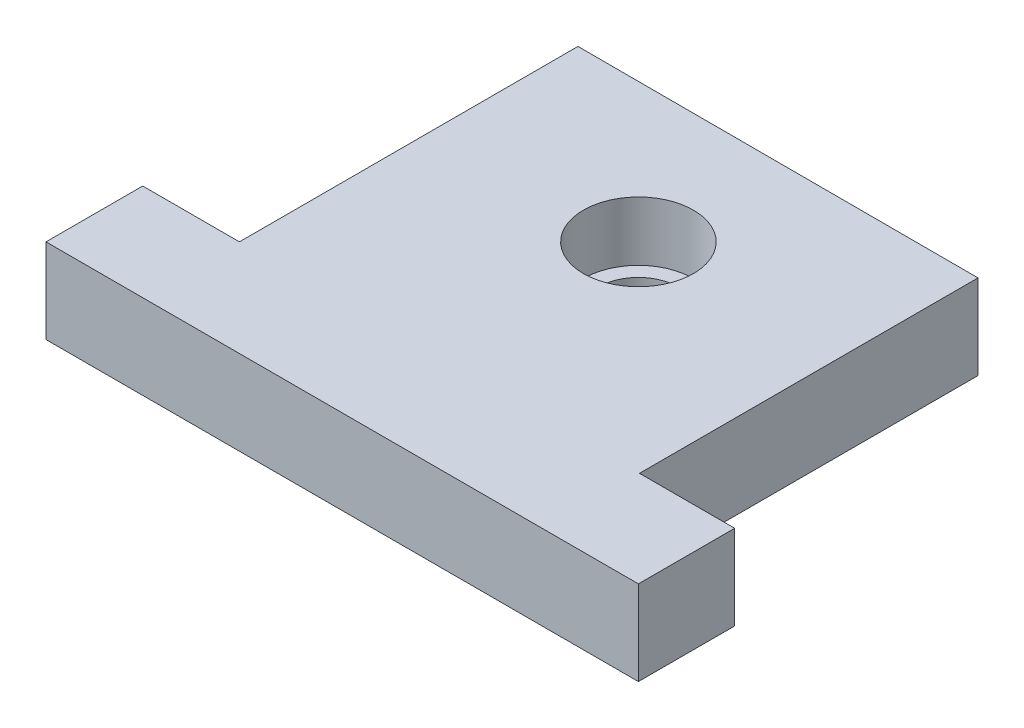
ISO-10303-21;
HEADER;
FILE_DESCRIPTION(('STEP AP214'),'2;1');
FILE_NAME('part.step','',(''),(''),'','','');
FILE_SCHEMA(('AUTOMOTIVE_DESIGN { 1 0 10303 214 1 1 1 1 }'));
ENDSEC;
DATA;
#1=APPLICATION_CONTEXT('core data for automotive mechanical design processes');
#2=APPLICATION_PROTOCOL_DEFINITION('international standard','automotive_design',2000,#1);
#3=PRODUCT_CONTEXT('',#1,'mechanical');
#4=PRODUCT('Part','Part','',(#3));
#5=PRODUCT_RELATED_PRODUCT_CATEGORY('part','',(#4));
#6=PRODUCT_DEFINITION_FORMATION('','',#4);
#7=PRODUCT_DEFINITION_CONTEXT('part definition',#1,'design');
#8=PRODUCT_DEFINITION('design','',#6,#7);
#9=PRODUCT_DEFINITION_SHAPE('','',#8);
#10=(LENGTH_UNIT() NAMED_UNIT(*) SI_UNIT(.MILLI.,.METRE.));
#11=(NAMED_UNIT(*) PLANE_ANGLE_UNIT() SI_UNIT($,.RADIAN.));
#12=(NAMED_UNIT(*) SI_UNIT($,.STERADIAN.) SOLID_ANGLE_UNIT());
#13=UNCERTAINTY_MEASURE_WITH_UNIT(LENGTH_MEASURE(1.E-05),#10,'distance_accuracy_value','');
#14=(GEOMETRIC_REPRESENTATION_CONTEXT(3) GLOBAL_UNCERTAINTY_ASSIGNED_CONTEXT((#13)) GLOBAL_UNIT_ASSIGNED_CONTEXT((#10,
#11,#12)) REPRESENTATION_CONTEXT('',''));
#15=CARTESIAN_POINT('',(0.,0.,0.));
#16=DIRECTION('',(0.,0.,1.));
#17=DIRECTION('',(1.,0.,0.));
#18=AXIS2_PLACEMENT_3D('',#15,#16,#17);
#19=CARTESIAN_POINT('',(0.0558575083497749,10.,-51.4028965849894));
#20=DIRECTION('',(0.00108666007329561,0.,-0.999999409584768));
#21=DIRECTION('',(-0.999999409584768,0.,-0.00108666007329561));
#22=AXIS2_PLACEMENT_3D('',#19,#20,#21);
#23=PLANE('',#22);
#24=DIRECTION('',(0.999999409584768,0.,0.00108666007329561));
#25=VECTOR('',#24,1.);
#26=CARTESIAN_POINT('',(0.0558575083497749,0.,-51.4028965849894));
#27=LINE('',#26,#25);
#28=CARTESIAN_POINT('',(-23.5714285714286,0.,-51.4285714285714));
#29=VERTEX_POINT('',#28);
#30=CARTESIAN_POINT('',(23.7521030428375,0.,-51.377146805877));
#31=VERTEX_POINT('',#30);
#32=EDGE_CURVE('E128',#29,#31,#27,.T.);
#33=ORIENTED_EDGE('',*,*,#32,.F.);
#34=DIRECTION('',(0.,-1.,0.));
#35=VECTOR('',#34,1.);
#36=CARTESIAN_POINT('',(-23.5714285714286,10.,-51.4285714285714));
#37=LINE('',#36,#35);
#38=CARTESIAN_POINT('',(-23.5714285714286,10.,-51.4285714285714));
#39=VERTEX_POINT('',#38);
#40=EDGE_CURVE('E11',#39,#29,#37,.T.);
#41=ORIENTED_EDGE('',*,*,#40,.F.);
#42=DIRECTION('',(0.999999409584768,0.,0.00108666007329561));
#43=VECTOR('',#42,1.);
#44=CARTESIAN_POINT('',(0.0558575083497749,10.,-51.4028965849894));
#45=LINE('',#44,#43);
#46=CARTESIAN_POINT('',(23.7521030428375,10.,-51.377146805877));
#47=VERTEX_POINT('',#46);
#48=EDGE_CURVE('E147',#39,#47,#45,.T.);
#49=ORIENTED_EDGE('',*,*,#48,.T.);
#50=DIRECTION('',(0.,-1.,0.));
#51=VECTOR('',#50,1.);
#52=CARTESIAN_POINT('',(23.7521030428375,10.,-51.377146805877));
#53=LINE('',#52,#51);
#54=EDGE_CURVE('E86',#47,#31,#53,.T.);
#55=ORIENTED_EDGE('',*,*,#54,.T.);
#56=EDGE_LOOP('',(#33,#41,#49,#55));
#57=FACE_BOUND('',#56,.T.);
#58=ADVANCED_FACE('F35',(#57),#23,.T.);
#59=CARTESIAN_POINT('',(-23.5714285714286,10.,0.));
#60=DIRECTION('',(-1.,0.,0.));
#61=DIRECTION('',(0.,0.,1.));
#62=AXIS2_PLACEMENT_3D('',#59,#60,#61);
#63=PLANE('',#62);
#64=DIRECTION('',(0.,0.,-1.));
#65=VECTOR('',#64,1.);
#66=CARTESIAN_POINT('',(-23.5714285714286,0.,0.));
#67=LINE('',#66,#65);
#68=CARTESIAN_POINT('',(-23.5714285714286,0.,-11.4285714285714));
#69=VERTEX_POINT('',#68);
#70=EDGE_CURVE('E131',#69,#29,#67,.T.);
#71=ORIENTED_EDGE('',*,*,#70,.F.);
#72=DIRECTION('',(0.,-1.,0.));
#73=VECTOR('',#72,1.);
#74=CARTESIAN_POINT('',(-23.5714285714286,10.,-11.4285714285714));
#75=LINE('',#74,#73);
#76=CARTESIAN_POINT('',(-23.5714285714286,10.,-11.4285714285714));
#77=VERTEX_POINT('',#76);
#78=EDGE_CURVE('E43',#77,#69,#75,.T.);
#79=ORIENTED_EDGE('',*,*,#78,.F.);
#80=DIRECTION('',(0.,0.,-1.));
#81=VECTOR('',#80,1.);
#82=CARTESIAN_POINT('',(-23.5714285714286,10.,0.));
#83=LINE('',#82,#81);
#84=EDGE_CURVE('E173',#77,#39,#83,.T.);
#85=ORIENTED_EDGE('',*,*,#84,.T.);
#86=ORIENTED_EDGE('',*,*,#40,.T.);
#87=EDGE_LOOP('',(#71,#79,#85,#86));
#88=FACE_BOUND('',#87,.T.);
#89=ADVANCED_FACE('F164',(#88),#63,.T.);
#90=CARTESIAN_POINT('',(0.,10.,-11.4285714285714));
#91=DIRECTION('',(0.,0.,-1.));
#92=DIRECTION('',(-1.,0.,0.));
#93=AXIS2_PLACEMENT_3D('',#90,#91,#92);
#94=PLANE('',#93);
#95=DIRECTION('',(1.,0.,0.));
#96=VECTOR('',#95,1.);
#97=CARTESIAN_POINT('',(0.,0.,-11.4285714285714));
#98=LINE('',#97,#96);
#99=CARTESIAN_POINT('',(-35.,0.,-11.4285714285714));
#100=VERTEX_POINT('',#99);
#101=EDGE_CURVE('E135',#100,#69,#98,.T.);
#102=ORIENTED_EDGE('',*,*,#101,.F.);
#103=DIRECTION('',(0.,-1.,0.));
#104=VECTOR('',#103,1.);
#105=CARTESIAN_POINT('',(-35.,10.,-11.4285714285714));
#106=LINE('',#105,#104);
#107=CARTESIAN_POINT('',(-35.,10.,-11.4285714285714));
#108=VERTEX_POINT('',#107);
#109=EDGE_CURVE('E153',#108,#100,#106,.T.);
#110=ORIENTED_EDGE('',*,*,#109,.F.);
#111=DIRECTION('',(1.,0.,0.));
#112=VECTOR('',#111,1.);
#113=CARTESIAN_POINT('',(0.,10.,-11.4285714285714));
#114=LINE('',#113,#112);
#115=EDGE_CURVE('E160',#108,#77,#114,.T.);
#116=ORIENTED_EDGE('',*,*,#115,.T.);
#117=ORIENTED_EDGE('',*,*,#78,.T.);
#118=EDGE_LOOP('',(#102,#110,#116,#117));
#119=FACE_BOUND('',#118,.T.);
#120=ADVANCED_FACE('F158',(#119),#94,.T.);
#121=CARTESIAN_POINT('',(-35.,10.,0.));
#122=DIRECTION('',(-1.,0.,0.));
#123=DIRECTION('',(0.,0.,1.));
#124=AXIS2_PLACEMENT_3D('',#121,#122,#123);
#125=PLANE('',#124);
#126=DIRECTION('',(0.,0.,-1.));
#127=VECTOR('',#126,1.);
#128=CARTESIAN_POINT('',(-35.,0.,0.));
#129=LINE('',#128,#127);
#130=CARTESIAN_POINT('',(-35.,0.,0.));
#131=VERTEX_POINT('',#130);
#132=EDGE_CURVE('E138',#131,#100,#129,.T.);
#133=ORIENTED_EDGE('',*,*,#132,.F.);
#134=DIRECTION('',(0.,-1.,0.));
#135=VECTOR('',#134,1.);
#136=CARTESIAN_POINT('',(-35.,10.,0.));
#137=LINE('',#136,#135);
#138=CARTESIAN_POINT('',(-35.,10.,0.));
#139=VERTEX_POINT('',#138);
#140=EDGE_CURVE('E151',#139,#131,#137,.T.);
#141=ORIENTED_EDGE('',*,*,#140,.F.);
#142=DIRECTION('',(0.,0.,-1.));
#143=VECTOR('',#142,1.);
#144=CARTESIAN_POINT('',(-35.,10.,0.));
#145=LINE('',#144,#143);
#146=EDGE_CURVE('E172',#139,#108,#145,.T.);
#147=ORIENTED_EDGE('',*,*,#146,.T.);
#148=ORIENTED_EDGE('',*,*,#109,.T.);
#149=EDGE_LOOP('',(#133,#141,#147,#148));
#150=FACE_BOUND('',#149,.T.);
#151=ADVANCED_FACE('F170',(#150),#125,.T.);
#152=CARTESIAN_POINT('',(0.,10.,0.));
#153=DIRECTION('',(0.,0.,-1.));
#154=DIRECTION('',(-1.,0.,0.));
#155=AXIS2_PLACEMENT_3D('',#152,#153,#154);
#156=PLANE('',#155);
#157=DIRECTION('',(1.,0.,0.));
#158=VECTOR('',#157,1.);
#159=CARTESIAN_POINT('',(0.,0.,0.));
#160=LINE('',#159,#158);
#161=CARTESIAN_POINT('',(35.,0.,0.));
#162=VERTEX_POINT('',#161);
#163=EDGE_CURVE('E141',#131,#162,#160,.T.);
#164=ORIENTED_EDGE('',*,*,#163,.T.);
#165=DIRECTION('',(0.,-1.,0.));
#166=VECTOR('',#165,1.);
#167=CARTESIAN_POINT('',(35.,10.,0.));
#168=LINE('',#167,#166);
#169=CARTESIAN_POINT('',(35.,10.,0.));
#170=VERTEX_POINT('',#169);
#171=EDGE_CURVE('E120',#170,#162,#168,.T.);
#172=ORIENTED_EDGE('',*,*,#171,.F.);
#173=DIRECTION('',(1.,0.,0.));
#174=VECTOR('',#173,1.);
#175=CARTESIAN_POINT('',(0.,10.,0.));
#176=LINE('',#175,#174);
#177=EDGE_CURVE('E111',#139,#170,#176,.T.);
#178=ORIENTED_EDGE('',*,*,#177,.F.);
#179=ORIENTED_EDGE('',*,*,#140,.T.);
#180=EDGE_LOOP('',(#164,#172,#178,#179));
#181=FACE_BOUND('',#180,.T.);
#182=ADVANCED_FACE('F232',(#181),#156,.F.);
#183=CARTESIAN_POINT('',(35.,10.,0.));
#184=DIRECTION('',(-1.,0.,0.));
#185=DIRECTION('',(0.,0.,1.));
#186=AXIS2_PLACEMENT_3D('',#183,#184,#185);
#187=PLANE('',#186);
#188=DIRECTION('',(0.,0.,-1.));
#189=VECTOR('',#188,1.);
#190=CARTESIAN_POINT('',(35.,0.,0.));
#191=LINE('',#190,#189);
#192=CARTESIAN_POINT('',(35.,0.,-11.377146805877));
#193=VERTEX_POINT('',#192);
#194=EDGE_CURVE('E119',#162,#193,#191,.T.);
#195=ORIENTED_EDGE('',*,*,#194,.T.);
#196=DIRECTION('',(0.,-1.,0.));
#197=VECTOR('',#196,1.);
#198=CARTESIAN_POINT('',(35.,10.,-11.377146805877));
#199=LINE('',#198,#197);
#200=CARTESIAN_POINT('',(35.,10.,-11.377146805877));
#201=VERTEX_POINT('',#200);
#202=EDGE_CURVE('E116',#201,#193,#199,.T.);
#203=ORIENTED_EDGE('',*,*,#202,.F.);
#204=DIRECTION('',(0.,0.,-1.));
#205=VECTOR('',#204,1.);
#206=CARTESIAN_POINT('',(35.,10.,0.));
#207=LINE('',#206,#205);
#208=EDGE_CURVE('E104',#170,#201,#207,.T.);
#209=ORIENTED_EDGE('',*,*,#208,.F.);
#210=ORIENTED_EDGE('',*,*,#171,.T.);
#211=EDGE_LOOP('',(#195,#203,#209,#210));
#212=FACE_BOUND('',#211,.T.);
#213=ADVANCED_FACE('F117',(#212),#187,.F.);
#214=CARTESIAN_POINT('',(0.,10.,-11.377146805877));
#215=DIRECTION('',(0.,0.,1.));
#216=DIRECTION('',(1.,0.,0.));
#217=AXIS2_PLACEMENT_3D('',#214,#215,#216);
#218=PLANE('',#217);
#219=DIRECTION('',(-1.,0.,0.));
#220=VECTOR('',#219,1.);
#221=CARTESIAN_POINT('',(0.,0.,-11.377146805877));
#222=LINE('',#221,#220);
#223=CARTESIAN_POINT('',(23.7521030428375,0.,-11.377146805877));
#224=VERTEX_POINT('',#223);
#225=EDGE_CURVE('E79',#193,#224,#222,.T.);
#226=ORIENTED_EDGE('',*,*,#225,.T.);
#227=DIRECTION('',(0.,-1.,0.));
#228=VECTOR('',#227,1.);
#229=CARTESIAN_POINT('',(23.7521030428375,10.,-11.377146805877));
#230=LINE('',#229,#228);
#231=CARTESIAN_POINT('',(23.7521030428375,10.,-11.377146805877));
#232=VERTEX_POINT('',#231);
#233=EDGE_CURVE('E121',#232,#224,#230,.T.);
#234=ORIENTED_EDGE('',*,*,#233,.F.);
#235=DIRECTION('',(-1.,0.,0.));
#236=VECTOR('',#235,1.);
#237=CARTESIAN_POINT('',(0.,10.,-11.377146805877));
#238=LINE('',#237,#236);
#239=EDGE_CURVE('E108',#201,#232,#238,.T.);
#240=ORIENTED_EDGE('',*,*,#239,.F.);
#241=ORIENTED_EDGE('',*,*,#202,.T.);
#242=EDGE_LOOP('',(#226,#234,#240,#241));
#243=FACE_BOUND('',#242,.T.);
#244=ADVANCED_FACE('F123',(#243),#218,.F.);
#245=CARTESIAN_POINT('',(23.7521030428375,10.,0.));
#246=DIRECTION('',(-1.,0.,0.));
#247=DIRECTION('',(0.,0.,1.));
#248=AXIS2_PLACEMENT_3D('',#245,#246,#247);
#249=PLANE('',#248);
#250=DIRECTION('',(0.,0.,-1.));
#251=VECTOR('',#250,1.);
#252=CARTESIAN_POINT('',(23.7521030428375,0.,0.));
#253=LINE('',#252,#251);
#254=EDGE_CURVE('E145',#224,#31,#253,.T.);
#255=ORIENTED_EDGE('',*,*,#254,.T.);
#256=ORIENTED_EDGE('',*,*,#54,.F.);
#257=DIRECTION('',(0.,0.,-1.));
#258=VECTOR('',#257,1.);
#259=CARTESIAN_POINT('',(23.7521030428375,10.,0.));
#260=LINE('',#259,#258);
#261=EDGE_CURVE('E51',#232,#47,#260,.T.);
#262=ORIENTED_EDGE('',*,*,#261,.F.);
#263=ORIENTED_EDGE('',*,*,#233,.T.);
#264=EDGE_LOOP('',(#255,#256,#262,#263));
#265=FACE_BOUND('',#264,.T.);
#266=ADVANCED_FACE('F211',(#265),#249,.F.);
#267=CARTESIAN_POINT('',(0.,10.,0.));
#268=DIRECTION('',(0.,1.,0.));
#269=DIRECTION('',(0.,0.,1.));
#270=AXIS2_PLACEMENT_3D('',#267,#268,#269);
#271=PLANE('',#270);
#272=CARTESIAN_POINT('',(0.,10.,-35.));
#273=DIRECTION('',(0.,1.,0.));
#274=DIRECTION('',(0.,0.,1.));
#275=AXIS2_PLACEMENT_3D('',#272,#273,#274);
#276=CIRCLE('',#275,6.5);
#277=CARTESIAN_POINT('',(0.,10.,-28.5));
#278=VERTEX_POINT('',#277);
#279=EDGE_CURVE('E179',#278,#278,#276,.T.);
#280=ORIENTED_EDGE('',*,*,#279,.F.);
#281=EDGE_LOOP('',(#280));
#282=FACE_BOUND('',#281,.T.);
#283=ORIENTED_EDGE('',*,*,#48,.F.);
#284=ORIENTED_EDGE('',*,*,#84,.F.);
#285=ORIENTED_EDGE('',*,*,#115,.F.);
#286=ORIENTED_EDGE('',*,*,#146,.F.);
#287=ORIENTED_EDGE('',*,*,#177,.T.);
#288=ORIENTED_EDGE('',*,*,#208,.T.);
#289=ORIENTED_EDGE('',*,*,#239,.T.);
#290=ORIENTED_EDGE('',*,*,#261,.T.);
#291=EDGE_LOOP('',(#283,#284,#285,#286,#287,#288,#289,#290));
#292=FACE_BOUND('',#291,.T.);
#293=ADVANCED_FACE('F106',(#282,#292),#271,.T.);
#294=CARTESIAN_POINT('',(0.,0.,0.));
#295=DIRECTION('',(0.,1.,0.));
#296=DIRECTION('',(0.,0.,1.));
#297=AXIS2_PLACEMENT_3D('',#294,#295,#296);
#298=PLANE('',#297);
#299=CARTESIAN_POINT('',(0.,0.,-35.));
#300=DIRECTION('',(0.,1.,0.));
#301=DIRECTION('',(0.,0.,1.));
#302=AXIS2_PLACEMENT_3D('',#299,#300,#301);
#303=CIRCLE('',#302,4.75);
#304=CARTESIAN_POINT('',(0.,0.,-30.25));
#305=VERTEX_POINT('',#304);
#306=EDGE_CURVE('E182',#305,#305,#303,.T.);
#307=ORIENTED_EDGE('',*,*,#306,.T.);
#308=EDGE_LOOP('',(#307));
#309=FACE_BOUND('',#308,.T.);
#310=ORIENTED_EDGE('',*,*,#32,.T.);
#311=ORIENTED_EDGE('',*,*,#254,.F.);
#312=ORIENTED_EDGE('',*,*,#225,.F.);
#313=ORIENTED_EDGE('',*,*,#194,.F.);
#314=ORIENTED_EDGE('',*,*,#163,.F.);
#315=ORIENTED_EDGE('',*,*,#132,.T.);
#316=ORIENTED_EDGE('',*,*,#101,.T.);
#317=ORIENTED_EDGE('',*,*,#70,.T.);
#318=EDGE_LOOP('',(#310,#311,#312,#313,#314,#315,#316,#317));
#319=FACE_BOUND('',#318,.T.);
#320=ADVANCED_FACE('F166',(#309,#319),#298,.F.);
#321=CARTESIAN_POINT('',(0.,3.,-35.));
#322=DIRECTION('',(0.,1.,0.));
#323=DIRECTION('',(0.,0.,1.));
#324=AXIS2_PLACEMENT_3D('',#321,#322,#323);
#325=CYLINDRICAL_SURFACE('',#324,6.5);
#326=CARTESIAN_POINT('',(0.,3.,-35.));
#327=DIRECTION('',(0.,1.,0.));
#328=DIRECTION('',(0.,0.,1.));
#329=AXIS2_PLACEMENT_3D('',#326,#327,#328);
#330=CIRCLE('',#329,6.5);
#331=CARTESIAN_POINT('',(0.,3.,-28.5));
#332=VERTEX_POINT('',#331);
#333=EDGE_CURVE('E132',#332,#332,#330,.T.);
#334=ORIENTED_EDGE('',*,*,#333,.F.);
#335=EDGE_LOOP('',(#334));
#336=FACE_BOUND('',#335,.T.);
#337=ORIENTED_EDGE('',*,*,#279,.T.);
#338=EDGE_LOOP('',(#337));
#339=FACE_BOUND('',#338,.T.);
#340=ADVANCED_FACE('F201',(#336,#339),#325,.F.);
#341=CARTESIAN_POINT('',(0.,3.,-35.));
#342=DIRECTION('',(0.,1.,0.));
#343=DIRECTION('',(0.,0.,1.));
#344=AXIS2_PLACEMENT_3D('',#341,#342,#343);
#345=PLANE('',#344);
#346=CARTESIAN_POINT('',(0.,3.,-35.));
#347=DIRECTION('',(0.,1.,0.));
#348=DIRECTION('',(0.,0.,1.));
#349=AXIS2_PLACEMENT_3D('',#346,#347,#348);
#350=CIRCLE('',#349,4.75);
#351=CARTESIAN_POINT('',(0.,3.,-30.25));
#352=VERTEX_POINT('',#351);
#353=EDGE_CURVE('E185',#352,#352,#350,.T.);
#354=ORIENTED_EDGE('',*,*,#353,.F.);
#355=EDGE_LOOP('',(#354));
#356=FACE_BOUND('',#355,.T.);
#357=ORIENTED_EDGE('',*,*,#333,.T.);
#358=EDGE_LOOP('',(#357));
#359=FACE_BOUND('',#358,.T.);
#360=ADVANCED_FACE('F195',(#356,#359),#345,.T.);
#361=CARTESIAN_POINT('',(0.,0.,-35.));
#362=DIRECTION('',(0.,1.,0.));
#363=DIRECTION('',(0.,0.,1.));
#364=AXIS2_PLACEMENT_3D('',#361,#362,#363);
#365=CYLINDRICAL_SURFACE('',#364,4.75);
#366=ORIENTED_EDGE('',*,*,#306,.F.);
#367=EDGE_LOOP('',(#366));
#368=FACE_BOUND('',#367,.T.);
#369=ORIENTED_EDGE('',*,*,#353,.T.);
#370=EDGE_LOOP('',(#369));
#371=FACE_BOUND('',#370,.T.);
#372=ADVANCED_FACE('F192',(#368,#371),#365,.F.);
#373=CLOSED_SHELL('',(#58,#89,#120,#151,#182,#213,#244,#266,#293,#320,#340,#360,#372));
#374=MANIFOLD_SOLID_BREP('B2',#373);
#375=ADVANCED_BREP_SHAPE_REPRESENTATION('',(#18,#374),#14);
#376=SHAPE_DEFINITION_REPRESENTATION(#9,#375);
ENDSEC;
END-ISO-10303-21;
